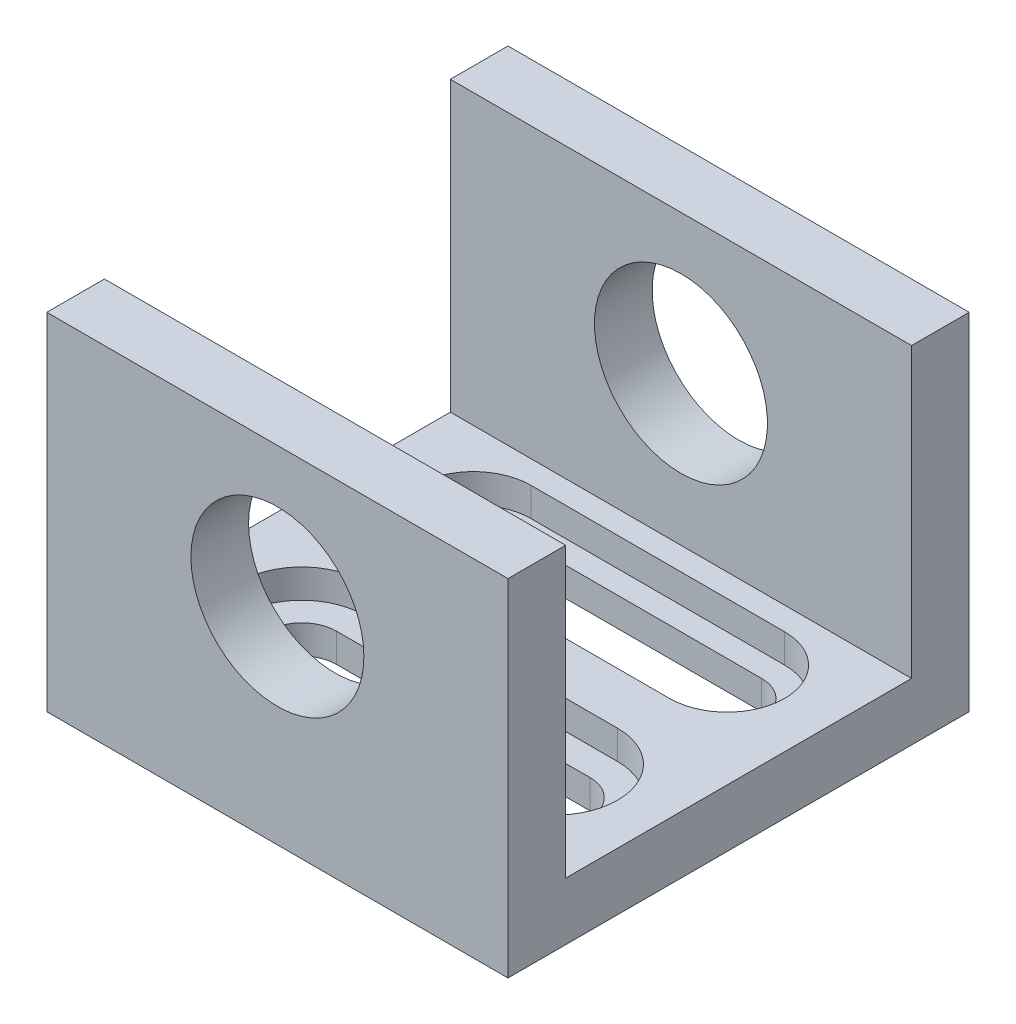
ISO-10303-21;
HEADER;
FILE_DESCRIPTION(('STEP AP214'),'2;1');
FILE_NAME('part.step','',(''),(''),'','','');
FILE_SCHEMA(('AUTOMOTIVE_DESIGN { 1 0 10303 214 1 1 1 1 }'));
ENDSEC;
DATA;
#1=APPLICATION_CONTEXT('core data for automotive mechanical design processes');
#2=APPLICATION_PROTOCOL_DEFINITION('international standard','automotive_design',2000,#1);
#3=PRODUCT_CONTEXT('',#1,'mechanical');
#4=PRODUCT('Part','Part','',(#3));
#5=PRODUCT_RELATED_PRODUCT_CATEGORY('part','',(#4));
#6=PRODUCT_DEFINITION_FORMATION('','',#4);
#7=PRODUCT_DEFINITION_CONTEXT('part definition',#1,'design');
#8=PRODUCT_DEFINITION('design','',#6,#7);
#9=PRODUCT_DEFINITION_SHAPE('','',#8);
#10=(LENGTH_UNIT() NAMED_UNIT(*) SI_UNIT(.MILLI.,.METRE.));
#11=(NAMED_UNIT(*) PLANE_ANGLE_UNIT() SI_UNIT($,.RADIAN.));
#12=(NAMED_UNIT(*) SI_UNIT($,.STERADIAN.) SOLID_ANGLE_UNIT());
#13=UNCERTAINTY_MEASURE_WITH_UNIT(LENGTH_MEASURE(1.E-05),#10,'distance_accuracy_value','');
#14=(GEOMETRIC_REPRESENTATION_CONTEXT(3) GLOBAL_UNCERTAINTY_ASSIGNED_CONTEXT((#13)) GLOBAL_UNIT_ASSIGNED_CONTEXT((#10,
#11,#12)) REPRESENTATION_CONTEXT('',''));
#15=CARTESIAN_POINT('',(0.,0.,0.));
#16=DIRECTION('',(0.,0.,1.));
#17=DIRECTION('',(1.,0.,0.));
#18=AXIS2_PLACEMENT_3D('',#15,#16,#17);
#19=CARTESIAN_POINT('',(-9.74589757868136,0.,0.));
#20=DIRECTION('',(0.,1.,0.));
#21=DIRECTION('',(-1.,0.,0.));
#22=AXIS2_PLACEMENT_3D('',#19,#20,#21);
#23=PLANE('',#22);
#24=DIRECTION('',(0.,0.,-1.));
#25=VECTOR('',#24,1.);
#26=CARTESIAN_POINT('',(-35.1458975786814,0.,0.));
#27=LINE('',#26,#25);
#28=CARTESIAN_POINT('',(-35.1458975786814,0.,22.225));
#29=VERTEX_POINT('',#28);
#30=CARTESIAN_POINT('',(-35.1458975786814,0.,-3.175));
#31=VERTEX_POINT('',#30);
#32=EDGE_CURVE('E316',#29,#31,#27,.T.);
#33=ORIENTED_EDGE('',*,*,#32,.T.);
#34=DIRECTION('',(-1.,0.,0.));
#35=VECTOR('',#34,1.);
#36=CARTESIAN_POINT('',(-9.74589757868136,0.,-3.175));
#37=LINE('',#36,#35);
#38=CARTESIAN_POINT('',(-9.74589757868136,0.,-3.175));
#39=VERTEX_POINT('',#38);
#40=EDGE_CURVE('E367',#39,#31,#37,.T.);
#41=ORIENTED_EDGE('',*,*,#40,.F.);
#42=DIRECTION('',(0.,0.,-1.));
#43=VECTOR('',#42,1.);
#44=CARTESIAN_POINT('',(-9.74589757868136,0.,-3.175));
#45=LINE('',#44,#43);
#46=CARTESIAN_POINT('',(-9.74589757868136,0.,22.225));
#47=VERTEX_POINT('',#46);
#48=EDGE_CURVE('E312',#47,#39,#45,.T.);
#49=ORIENTED_EDGE('',*,*,#48,.F.);
#50=DIRECTION('',(-1.,0.,0.));
#51=VECTOR('',#50,1.);
#52=CARTESIAN_POINT('',(-9.74589757868136,0.,22.225));
#53=LINE('',#52,#51);
#54=EDGE_CURVE('E331',#47,#29,#53,.T.);
#55=ORIENTED_EDGE('',*,*,#54,.T.);
#56=EDGE_LOOP('',(#33,#41,#49,#55));
#57=FACE_BOUND('',#56,.T.);
#58=DIRECTION('',(1.,0.,0.));
#59=VECTOR('',#58,1.);
#60=CARTESIAN_POINT('',(-9.74589757868136,0.,2.54));
#61=LINE('',#60,#59);
#62=CARTESIAN_POINT('',(-29.4308975786814,0.,2.54));
#63=VERTEX_POINT('',#62);
#64=CARTESIAN_POINT('',(-15.4608975786814,0.,2.54));
#65=VERTEX_POINT('',#64);
#66=EDGE_CURVE('E378',#63,#65,#61,.T.);
#67=ORIENTED_EDGE('',*,*,#66,.F.);
#68=CARTESIAN_POINT('',(-29.4308975786814,0.,4.445));
#69=DIRECTION('',(0.,1.,0.));
#70=DIRECTION('',(-1.,0.,0.));
#71=AXIS2_PLACEMENT_3D('',#68,#69,#70);
#72=CIRCLE('',#71,1.905);
#73=CARTESIAN_POINT('',(-29.4308975786814,0.,6.35));
#74=VERTEX_POINT('',#73);
#75=EDGE_CURVE('E380',#63,#74,#72,.T.);
#76=ORIENTED_EDGE('',*,*,#75,.T.);
#77=DIRECTION('',(1.,0.,0.));
#78=VECTOR('',#77,1.);
#79=CARTESIAN_POINT('',(-9.74589757868136,0.,6.35));
#80=LINE('',#79,#78);
#81=CARTESIAN_POINT('',(-15.4608975786814,0.,6.35));
#82=VERTEX_POINT('',#81);
#83=EDGE_CURVE('E370',#74,#82,#80,.T.);
#84=ORIENTED_EDGE('',*,*,#83,.T.);
#85=CARTESIAN_POINT('',(-15.4608975786814,0.,4.445));
#86=DIRECTION('',(0.,1.,0.));
#87=DIRECTION('',(-1.,0.,0.));
#88=AXIS2_PLACEMENT_3D('',#85,#86,#87);
#89=CIRCLE('',#88,1.905);
#90=EDGE_CURVE('E375',#65,#82,#89,.F.);
#91=ORIENTED_EDGE('',*,*,#90,.F.);
#92=EDGE_LOOP('',(#67,#76,#84,#91));
#93=FACE_BOUND('',#92,.T.);
#94=DIRECTION('',(1.,0.,0.));
#95=VECTOR('',#94,1.);
#96=CARTESIAN_POINT('',(0.,0.,11.9938408030583));
#97=LINE('',#96,#95);
#98=CARTESIAN_POINT('',(-29.4308975786814,0.,11.9938408030583));
#99=VERTEX_POINT('',#98);
#100=CARTESIAN_POINT('',(-15.4608975786814,0.,11.9938408030583));
#101=VERTEX_POINT('',#100);
#102=EDGE_CURVE('E197',#99,#101,#97,.T.);
#103=ORIENTED_EDGE('',*,*,#102,.F.);
#104=CARTESIAN_POINT('',(-29.4308975786814,0.,13.8988408030583));
#105=DIRECTION('',(0.,1.,0.));
#106=DIRECTION('',(-1.,0.,0.));
#107=AXIS2_PLACEMENT_3D('',#104,#105,#106);
#108=CIRCLE('',#107,1.905);
#109=CARTESIAN_POINT('',(-29.4308975786814,0.,15.8038408030583));
#110=VERTEX_POINT('',#109);
#111=EDGE_CURVE('E204',#99,#110,#108,.T.);
#112=ORIENTED_EDGE('',*,*,#111,.T.);
#113=DIRECTION('',(1.,0.,0.));
#114=VECTOR('',#113,1.);
#115=CARTESIAN_POINT('',(0.,0.,15.8038408030583));
#116=LINE('',#115,#114);
#117=CARTESIAN_POINT('',(-15.4608975786814,0.,15.8038408030583));
#118=VERTEX_POINT('',#117);
#119=EDGE_CURVE('E49',#110,#118,#116,.T.);
#120=ORIENTED_EDGE('',*,*,#119,.T.);
#121=CARTESIAN_POINT('',(-15.4608975786814,0.,13.8988408030583));
#122=DIRECTION('',(0.,1.,0.));
#123=DIRECTION('',(-1.,0.,0.));
#124=AXIS2_PLACEMENT_3D('',#121,#122,#123);
#125=CIRCLE('',#124,1.905);
#126=EDGE_CURVE('E201',#118,#101,#125,.T.);
#127=ORIENTED_EDGE('',*,*,#126,.T.);
#128=EDGE_LOOP('',(#103,#112,#120,#127));
#129=FACE_BOUND('',#128,.T.);
#130=ADVANCED_FACE('F34',(#57,#93,#129),#23,.F.);
#131=CARTESIAN_POINT('',(0.,1.5875,0.));
#132=DIRECTION('',(0.,1.,0.));
#133=DIRECTION('',(-1.,0.,0.));
#134=AXIS2_PLACEMENT_3D('',#131,#132,#133);
#135=PLANE('',#134);
#136=DIRECTION('',(-1.,0.,0.));
#137=VECTOR('',#136,1.);
#138=CARTESIAN_POINT('',(0.,1.5875,17.3278408030583));
#139=LINE('',#138,#137);
#140=CARTESIAN_POINT('',(-15.4608975786814,1.5875,17.3278408030583));
#141=VERTEX_POINT('',#140);
#142=CARTESIAN_POINT('',(-29.4308975786814,1.58750000000001,17.3278408030583));
#143=VERTEX_POINT('',#142);
#144=EDGE_CURVE('E221',#141,#143,#139,.T.);
#145=ORIENTED_EDGE('',*,*,#144,.F.);
#146=CARTESIAN_POINT('',(-15.4608975786814,1.58750000000001,13.8988408030583));
#147=DIRECTION('',(0.,1.,0.));
#148=DIRECTION('',(-1.,0.,0.));
#149=AXIS2_PLACEMENT_3D('',#146,#147,#148);
#150=CIRCLE('',#149,3.429);
#151=CARTESIAN_POINT('',(-15.4608975786814,1.58750000000001,10.4698408030583));
#152=VERTEX_POINT('',#151);
#153=EDGE_CURVE('E223',#141,#152,#150,.T.);
#154=ORIENTED_EDGE('',*,*,#153,.T.);
#155=DIRECTION('',(1.,0.,0.));
#156=VECTOR('',#155,1.);
#157=CARTESIAN_POINT('',(0.,1.5875,10.4698408030583));
#158=LINE('',#157,#156);
#159=CARTESIAN_POINT('',(-29.4308975786814,1.58750000000001,10.4698408030583));
#160=VERTEX_POINT('',#159);
#161=EDGE_CURVE('E227',#160,#152,#158,.T.);
#162=ORIENTED_EDGE('',*,*,#161,.F.);
#163=CARTESIAN_POINT('',(-29.4308975786814,1.58750000000001,13.8988408030583));
#164=DIRECTION('',(0.,1.,0.));
#165=DIRECTION('',(-1.,0.,0.));
#166=AXIS2_PLACEMENT_3D('',#163,#164,#165);
#167=CIRCLE('',#166,3.429);
#168=EDGE_CURVE('E229',#160,#143,#167,.T.);
#169=ORIENTED_EDGE('',*,*,#168,.T.);
#170=EDGE_LOOP('',(#145,#154,#162,#169));
#171=FACE_BOUND('',#170,.T.);
#172=CARTESIAN_POINT('',(-29.4308975786814,1.58750000000001,13.8988408030583));
#173=DIRECTION('',(0.,1.,0.));
#174=DIRECTION('',(-1.,0.,0.));
#175=AXIS2_PLACEMENT_3D('',#172,#173,#174);
#176=CIRCLE('',#175,1.905);
#177=CARTESIAN_POINT('',(-29.4308975786814,1.58750000000001,11.9938408030583));
#178=VERTEX_POINT('',#177);
#179=CARTESIAN_POINT('',(-29.4308975786814,1.58750000000001,15.8038408030583));
#180=VERTEX_POINT('',#179);
#181=EDGE_CURVE('E385',#178,#180,#176,.T.);
#182=ORIENTED_EDGE('',*,*,#181,.F.);
#183=DIRECTION('',(1.,0.,0.));
#184=VECTOR('',#183,1.);
#185=CARTESIAN_POINT('',(0.,1.5875,11.9938408030583));
#186=LINE('',#185,#184);
#187=CARTESIAN_POINT('',(-15.4608975786814,1.58750000000001,11.9938408030583));
#188=VERTEX_POINT('',#187);
#189=EDGE_CURVE('E11',#178,#188,#186,.T.);
#190=ORIENTED_EDGE('',*,*,#189,.T.);
#191=CARTESIAN_POINT('',(-15.4608975786814,1.58750000000001,13.8988408030583));
#192=DIRECTION('',(0.,1.,0.));
#193=DIRECTION('',(-1.,0.,0.));
#194=AXIS2_PLACEMENT_3D('',#191,#192,#193);
#195=CIRCLE('',#194,1.905);
#196=CARTESIAN_POINT('',(-15.4608975786814,1.58750000000001,15.8038408030583));
#197=VERTEX_POINT('',#196);
#198=EDGE_CURVE('E42',#197,#188,#195,.T.);
#199=ORIENTED_EDGE('',*,*,#198,.F.);
#200=DIRECTION('',(1.,0.,0.));
#201=VECTOR('',#200,1.);
#202=CARTESIAN_POINT('',(0.,1.5875,15.8038408030583));
#203=LINE('',#202,#201);
#204=EDGE_CURVE('E387',#180,#197,#203,.T.);
#205=ORIENTED_EDGE('',*,*,#204,.F.);
#206=EDGE_LOOP('',(#182,#190,#199,#205));
#207=FACE_BOUND('',#206,.T.);
#208=ADVANCED_FACE('F393',(#171,#207),#135,.T.);
#209=CARTESIAN_POINT('',(-9.74589757868136,3.175,0.));
#210=DIRECTION('',(0.,-1.,0.));
#211=DIRECTION('',(1.,0.,0.));
#212=AXIS2_PLACEMENT_3D('',#209,#210,#211);
#213=PLANE('',#212);
#214=DIRECTION('',(0.,0.,1.));
#215=VECTOR('',#214,1.);
#216=CARTESIAN_POINT('',(-35.1458975786814,3.17500000000001,0.));
#217=LINE('',#216,#215);
#218=CARTESIAN_POINT('',(-35.1458975786814,3.17500000000001,0.));
#219=VERTEX_POINT('',#218);
#220=CARTESIAN_POINT('',(-35.1458975786814,3.17500000000001,19.05));
#221=VERTEX_POINT('',#220);
#222=EDGE_CURVE('E337',#219,#221,#217,.T.);
#223=ORIENTED_EDGE('',*,*,#222,.T.);
#224=DIRECTION('',(-1.,0.,0.));
#225=VECTOR('',#224,1.);
#226=CARTESIAN_POINT('',(-9.74589757868136,3.175,19.05));
#227=LINE('',#226,#225);
#228=CARTESIAN_POINT('',(-9.74589757868136,3.175,19.05));
#229=VERTEX_POINT('',#228);
#230=EDGE_CURVE('E355',#229,#221,#227,.T.);
#231=ORIENTED_EDGE('',*,*,#230,.F.);
#232=DIRECTION('',(0.,0.,1.));
#233=VECTOR('',#232,1.);
#234=CARTESIAN_POINT('',(-9.74589757868136,3.175,0.));
#235=LINE('',#234,#233);
#236=CARTESIAN_POINT('',(-9.74589757868136,3.175,0.));
#237=VERTEX_POINT('',#236);
#238=EDGE_CURVE('E322',#237,#229,#235,.T.);
#239=ORIENTED_EDGE('',*,*,#238,.F.);
#240=DIRECTION('',(-1.,0.,0.));
#241=VECTOR('',#240,1.);
#242=CARTESIAN_POINT('',(-9.74589757868136,3.175,0.));
#243=LINE('',#242,#241);
#244=EDGE_CURVE('E358',#237,#219,#243,.T.);
#245=ORIENTED_EDGE('',*,*,#244,.T.);
#246=EDGE_LOOP('',(#223,#231,#239,#245));
#247=FACE_BOUND('',#246,.T.);
#248=DIRECTION('',(1.,0.,0.));
#249=VECTOR('',#248,1.);
#250=CARTESIAN_POINT('',(-29.4308975786814,3.17500000000001,7.62));
#251=LINE('',#250,#249);
#252=CARTESIAN_POINT('',(-29.4308975786814,3.17500000000001,7.62));
#253=VERTEX_POINT('',#252);
#254=CARTESIAN_POINT('',(-15.4608975786814,3.17500000000001,7.62));
#255=VERTEX_POINT('',#254);
#256=EDGE_CURVE('E265',#253,#255,#251,.T.);
#257=ORIENTED_EDGE('',*,*,#256,.F.);
#258=CARTESIAN_POINT('',(-29.4308975786814,3.17500000000001,4.445));
#259=DIRECTION('',(0.,1.,0.));
#260=DIRECTION('',(-1.,0.,0.));
#261=AXIS2_PLACEMENT_3D('',#258,#259,#260);
#262=CIRCLE('',#261,3.175);
#263=CARTESIAN_POINT('',(-29.4308975786814,3.17500000000001,1.27));
#264=VERTEX_POINT('',#263);
#265=EDGE_CURVE('E245',#264,#253,#262,.T.);
#266=ORIENTED_EDGE('',*,*,#265,.F.);
#267=DIRECTION('',(1.,0.,0.));
#268=VECTOR('',#267,1.);
#269=CARTESIAN_POINT('',(-29.4308975786814,3.17500000000001,1.27));
#270=LINE('',#269,#268);
#271=CARTESIAN_POINT('',(-15.4608975786814,3.17500000000001,1.27));
#272=VERTEX_POINT('',#271);
#273=EDGE_CURVE('E256',#264,#272,#270,.T.);
#274=ORIENTED_EDGE('',*,*,#273,.T.);
#275=CARTESIAN_POINT('',(-15.4608975786814,3.17500000000001,4.445));
#276=DIRECTION('',(0.,-1.,0.));
#277=DIRECTION('',(1.,0.,0.));
#278=AXIS2_PLACEMENT_3D('',#275,#276,#277);
#279=CIRCLE('',#278,3.175);
#280=EDGE_CURVE('E268',#272,#255,#279,.T.);
#281=ORIENTED_EDGE('',*,*,#280,.T.);
#282=EDGE_LOOP('',(#257,#266,#274,#281));
#283=FACE_BOUND('',#282,.T.);
#284=DIRECTION('',(-1.,0.,0.));
#285=VECTOR('',#284,1.);
#286=CARTESIAN_POINT('',(0.,3.175,17.3278408030583));
#287=LINE('',#286,#285);
#288=CARTESIAN_POINT('',(-15.4608975786814,3.175,17.3278408030583));
#289=VERTEX_POINT('',#288);
#290=CARTESIAN_POINT('',(-29.4308975786814,3.17500000000001,17.3278408030583));
#291=VERTEX_POINT('',#290);
#292=EDGE_CURVE('E216',#289,#291,#287,.T.);
#293=ORIENTED_EDGE('',*,*,#292,.T.);
#294=CARTESIAN_POINT('',(-29.4308975786814,3.17500000000001,13.8988408030583));
#295=DIRECTION('',(0.,1.,0.));
#296=DIRECTION('',(-1.,0.,0.));
#297=AXIS2_PLACEMENT_3D('',#294,#295,#296);
#298=CIRCLE('',#297,3.429);
#299=CARTESIAN_POINT('',(-29.4308975786814,3.17500000000001,10.4698408030583));
#300=VERTEX_POINT('',#299);
#301=EDGE_CURVE('E224',#300,#291,#298,.T.);
#302=ORIENTED_EDGE('',*,*,#301,.F.);
#303=DIRECTION('',(1.,0.,0.));
#304=VECTOR('',#303,1.);
#305=CARTESIAN_POINT('',(0.,3.175,10.4698408030583));
#306=LINE('',#305,#304);
#307=CARTESIAN_POINT('',(-15.4608975786814,3.17500000000001,10.4698408030583));
#308=VERTEX_POINT('',#307);
#309=EDGE_CURVE('E238',#300,#308,#306,.T.);
#310=ORIENTED_EDGE('',*,*,#309,.T.);
#311=CARTESIAN_POINT('',(-15.4608975786814,3.17500000000001,13.8988408030583));
#312=DIRECTION('',(0.,1.,0.));
#313=DIRECTION('',(-1.,0.,0.));
#314=AXIS2_PLACEMENT_3D('',#311,#312,#313);
#315=CIRCLE('',#314,3.429);
#316=EDGE_CURVE('E235',#289,#308,#315,.T.);
#317=ORIENTED_EDGE('',*,*,#316,.F.);
#318=EDGE_LOOP('',(#293,#302,#310,#317));
#319=FACE_BOUND('',#318,.T.);
#320=ADVANCED_FACE('F409',(#247,#283,#319),#213,.F.);
#321=CARTESIAN_POINT('',(-29.4308975786814,-62.865,4.44499999999999));
#322=DIRECTION('',(0.,1.,0.));
#323=DIRECTION('',(-1.,0.,0.));
#324=AXIS2_PLACEMENT_3D('',#321,#322,#323);
#325=CYLINDRICAL_SURFACE('',#324,1.905);
#326=CARTESIAN_POINT('',(-29.4308975786814,1.58750000000001,4.445));
#327=DIRECTION('',(0.,1.,0.));
#328=DIRECTION('',(-1.,0.,0.));
#329=AXIS2_PLACEMENT_3D('',#326,#327,#328);
#330=CIRCLE('',#329,1.905);
#331=CARTESIAN_POINT('',(-29.4308975786814,1.58750000000001,6.35));
#332=VERTEX_POINT('',#331);
#333=CARTESIAN_POINT('',(-29.4308975786814,1.58750000000001,2.54));
#334=VERTEX_POINT('',#333);
#335=EDGE_CURVE('E287',#332,#334,#330,.F.);
#336=ORIENTED_EDGE('',*,*,#335,.F.);
#337=DIRECTION('',(0.,1.,0.));
#338=VECTOR('',#337,1.);
#339=CARTESIAN_POINT('',(-29.4308975786814,-62.865,6.34999999999999));
#340=LINE('',#339,#338);
#341=EDGE_CURVE('E289',#74,#332,#340,.T.);
#342=ORIENTED_EDGE('',*,*,#341,.F.);
#343=ORIENTED_EDGE('',*,*,#75,.F.);
#344=DIRECTION('',(0.,1.,0.));
#345=VECTOR('',#344,1.);
#346=CARTESIAN_POINT('',(-29.4308975786814,-62.865,2.53999999999999));
#347=LINE('',#346,#345);
#348=EDGE_CURVE('E290',#63,#334,#347,.T.);
#349=ORIENTED_EDGE('',*,*,#348,.T.);
#350=EDGE_LOOP('',(#336,#342,#343,#349));
#351=FACE_BOUND('',#350,.T.);
#352=ADVANCED_FACE('F433',(#351),#325,.F.);
#353=CARTESIAN_POINT('',(-29.4308975786814,-62.865,2.53999999999999));
#354=DIRECTION('',(0.,0.,1.));
#355=DIRECTION('',(0.,-1.,0.));
#356=AXIS2_PLACEMENT_3D('',#353,#354,#355);
#357=PLANE('',#356);
#358=DIRECTION('',(0.,1.,0.));
#359=VECTOR('',#358,1.);
#360=CARTESIAN_POINT('',(-15.4608975786814,-62.865,2.53999999999999));
#361=LINE('',#360,#359);
#362=CARTESIAN_POINT('',(-15.4608975786814,1.58750000000001,2.54));
#363=VERTEX_POINT('',#362);
#364=EDGE_CURVE('E294',#65,#363,#361,.T.);
#365=ORIENTED_EDGE('',*,*,#364,.T.);
#366=DIRECTION('',(-1.,0.,0.));
#367=VECTOR('',#366,1.);
#368=CARTESIAN_POINT('',(-29.4308975786814,1.58750000000001,2.54));
#369=LINE('',#368,#367);
#370=EDGE_CURVE('E284',#363,#334,#369,.T.);
#371=ORIENTED_EDGE('',*,*,#370,.T.);
#372=ORIENTED_EDGE('',*,*,#348,.F.);
#373=ORIENTED_EDGE('',*,*,#66,.T.);
#374=EDGE_LOOP('',(#365,#371,#372,#373));
#375=FACE_BOUND('',#374,.T.);
#376=ADVANCED_FACE('F486',(#375),#357,.T.);
#377=CARTESIAN_POINT('',(-15.4608975786814,-62.865,4.44499999999999));
#378=DIRECTION('',(0.,1.,0.));
#379=DIRECTION('',(-1.,0.,0.));
#380=AXIS2_PLACEMENT_3D('',#377,#378,#379);
#381=CYLINDRICAL_SURFACE('',#380,1.905);
#382=DIRECTION('',(0.,1.,0.));
#383=VECTOR('',#382,1.);
#384=CARTESIAN_POINT('',(-15.4608975786814,-62.865,6.34999999999999));
#385=LINE('',#384,#383);
#386=CARTESIAN_POINT('',(-15.4608975786814,1.58750000000001,6.35));
#387=VERTEX_POINT('',#386);
#388=EDGE_CURVE('E297',#82,#387,#385,.T.);
#389=ORIENTED_EDGE('',*,*,#388,.T.);
#390=CARTESIAN_POINT('',(-15.4608975786814,1.58750000000001,4.445));
#391=DIRECTION('',(0.,1.,0.));
#392=DIRECTION('',(-1.,0.,0.));
#393=AXIS2_PLACEMENT_3D('',#390,#391,#392);
#394=CIRCLE('',#393,1.905);
#395=EDGE_CURVE('E275',#387,#363,#394,.T.);
#396=ORIENTED_EDGE('',*,*,#395,.T.);
#397=ORIENTED_EDGE('',*,*,#364,.F.);
#398=ORIENTED_EDGE('',*,*,#90,.T.);
#399=EDGE_LOOP('',(#389,#396,#397,#398));
#400=FACE_BOUND('',#399,.T.);
#401=ADVANCED_FACE('F490',(#400),#381,.F.);
#402=CARTESIAN_POINT('',(-29.4308975786814,-62.865,6.34999999999999));
#403=DIRECTION('',(0.,0.,1.));
#404=DIRECTION('',(0.,-1.,0.));
#405=AXIS2_PLACEMENT_3D('',#402,#403,#404);
#406=PLANE('',#405);
#407=DIRECTION('',(-1.,0.,0.));
#408=VECTOR('',#407,1.);
#409=CARTESIAN_POINT('',(-29.4308975786814,1.58750000000001,6.35));
#410=LINE('',#409,#408);
#411=EDGE_CURVE('E383',#387,#332,#410,.T.);
#412=ORIENTED_EDGE('',*,*,#411,.F.);
#413=ORIENTED_EDGE('',*,*,#388,.F.);
#414=ORIENTED_EDGE('',*,*,#83,.F.);
#415=ORIENTED_EDGE('',*,*,#341,.T.);
#416=EDGE_LOOP('',(#412,#413,#414,#415));
#417=FACE_BOUND('',#416,.T.);
#418=ADVANCED_FACE('F443',(#417),#406,.F.);
#419=CARTESIAN_POINT('',(-9.74589757868135,19.05,-3.175));
#420=DIRECTION('',(0.,0.,1.));
#421=DIRECTION('',(0.,-1.,0.));
#422=AXIS2_PLACEMENT_3D('',#419,#420,#421);
#423=PLANE('',#422);
#424=CARTESIAN_POINT('',(-22.4458975786814,11.3665,-3.175));
#425=DIRECTION('',(0.,0.,-1.));
#426=DIRECTION('',(0.,1.,0.));
#427=AXIS2_PLACEMENT_3D('',#424,#425,#426);
#428=CIRCLE('',#427,4.7625);
#429=CARTESIAN_POINT('',(-22.4458975786814,16.129,-3.175));
#430=VERTEX_POINT('',#429);
#431=EDGE_CURVE('E293',#430,#430,#428,.T.);
#432=ORIENTED_EDGE('',*,*,#431,.F.);
#433=EDGE_LOOP('',(#432));
#434=FACE_BOUND('',#433,.T.);
#435=DIRECTION('',(0.,1.,0.));
#436=VECTOR('',#435,1.);
#437=CARTESIAN_POINT('',(-35.1458975786813,19.05,-3.175));
#438=LINE('',#437,#436);
#439=CARTESIAN_POINT('',(-35.1458975786813,19.05,-3.175));
#440=VERTEX_POINT('',#439);
#441=EDGE_CURVE('E311',#31,#440,#438,.T.);
#442=ORIENTED_EDGE('',*,*,#441,.T.);
#443=DIRECTION('',(-1.,0.,0.));
#444=VECTOR('',#443,1.);
#445=CARTESIAN_POINT('',(-9.74589757868135,19.05,-3.175));
#446=LINE('',#445,#444);
#447=CARTESIAN_POINT('',(-9.74589757868135,19.05,-3.175));
#448=VERTEX_POINT('',#447);
#449=EDGE_CURVE('E364',#448,#440,#446,.T.);
#450=ORIENTED_EDGE('',*,*,#449,.F.);
#451=DIRECTION('',(0.,1.,0.));
#452=VECTOR('',#451,1.);
#453=CARTESIAN_POINT('',(-9.74589757868135,19.05,-3.175));
#454=LINE('',#453,#452);
#455=EDGE_CURVE('E315',#39,#448,#454,.T.);
#456=ORIENTED_EDGE('',*,*,#455,.F.);
#457=ORIENTED_EDGE('',*,*,#40,.T.);
#458=EDGE_LOOP('',(#442,#450,#456,#457));
#459=FACE_BOUND('',#458,.T.);
#460=ADVANCED_FACE('F36',(#434,#459),#423,.F.);
#461=CARTESIAN_POINT('',(-9.74589757868135,19.05,-3.175));
#462=DIRECTION('',(0.,-1.,0.));
#463=DIRECTION('',(1.,0.,0.));
#464=AXIS2_PLACEMENT_3D('',#461,#462,#463);
#465=PLANE('',#464);
#466=DIRECTION('',(0.,0.,1.));
#467=VECTOR('',#466,1.);
#468=CARTESIAN_POINT('',(-35.1458975786813,19.05,-3.175));
#469=LINE('',#468,#467);
#470=CARTESIAN_POINT('',(-35.1458975786813,19.05,0.));
#471=VERTEX_POINT('',#470);
#472=EDGE_CURVE('E333',#440,#471,#469,.T.);
#473=ORIENTED_EDGE('',*,*,#472,.T.);
#474=DIRECTION('',(-1.,0.,0.));
#475=VECTOR('',#474,1.);
#476=CARTESIAN_POINT('',(-9.74589757868135,19.05,0.));
#477=LINE('',#476,#475);
#478=CARTESIAN_POINT('',(-9.74589757868135,19.05,0.));
#479=VERTEX_POINT('',#478);
#480=EDGE_CURVE('E361',#479,#471,#477,.T.);
#481=ORIENTED_EDGE('',*,*,#480,.F.);
#482=DIRECTION('',(0.,0.,1.));
#483=VECTOR('',#482,1.);
#484=CARTESIAN_POINT('',(-9.74589757868135,19.05,-3.175));
#485=LINE('',#484,#483);
#486=EDGE_CURVE('E318',#448,#479,#485,.T.);
#487=ORIENTED_EDGE('',*,*,#486,.F.);
#488=ORIENTED_EDGE('',*,*,#449,.T.);
#489=EDGE_LOOP('',(#473,#481,#487,#488));
#490=FACE_BOUND('',#489,.T.);
#491=ADVANCED_FACE('F436',(#490),#465,.F.);
#492=CARTESIAN_POINT('',(-9.74589757868135,19.05,0.));
#493=DIRECTION('',(0.,0.,-1.));
#494=DIRECTION('',(0.,1.,0.));
#495=AXIS2_PLACEMENT_3D('',#492,#493,#494);
#496=PLANE('',#495);
#497=CARTESIAN_POINT('',(-22.4458975786814,11.3665,0.));
#498=DIRECTION('',(0.,0.,-1.));
#499=DIRECTION('',(0.,1.,0.));
#500=AXIS2_PLACEMENT_3D('',#497,#498,#499);
#501=CIRCLE('',#500,4.7625);
#502=CARTESIAN_POINT('',(-22.4458975786814,16.129,0.));
#503=VERTEX_POINT('',#502);
#504=EDGE_CURVE('E308',#503,#503,#501,.T.);
#505=ORIENTED_EDGE('',*,*,#504,.T.);
#506=EDGE_LOOP('',(#505));
#507=FACE_BOUND('',#506,.T.);
#508=DIRECTION('',(0.,-1.,0.));
#509=VECTOR('',#508,1.);
#510=CARTESIAN_POINT('',(-35.1458975786813,19.05,0.));
#511=LINE('',#510,#509);
#512=EDGE_CURVE('E335',#471,#219,#511,.T.);
#513=ORIENTED_EDGE('',*,*,#512,.T.);
#514=ORIENTED_EDGE('',*,*,#244,.F.);
#515=DIRECTION('',(0.,-1.,0.));
#516=VECTOR('',#515,1.);
#517=CARTESIAN_POINT('',(-9.74589757868135,19.05,0.));
#518=LINE('',#517,#516);
#519=EDGE_CURVE('E320',#479,#237,#518,.T.);
#520=ORIENTED_EDGE('',*,*,#519,.F.);
#521=ORIENTED_EDGE('',*,*,#480,.T.);
#522=EDGE_LOOP('',(#513,#514,#520,#521));
#523=FACE_BOUND('',#522,.T.);
#524=ADVANCED_FACE('F429',(#507,#523),#496,.F.);
#525=CARTESIAN_POINT('',(-9.74589757868136,3.175,19.05));
#526=DIRECTION('',(0.,0.,1.));
#527=DIRECTION('',(1.,0.,0.));
#528=AXIS2_PLACEMENT_3D('',#525,#526,#527);
#529=PLANE('',#528);
#530=CARTESIAN_POINT('',(-22.4458975786814,11.3665,19.05));
#531=DIRECTION('',(0.,0.,1.));
#532=DIRECTION('',(1.,0.,0.));
#533=AXIS2_PLACEMENT_3D('',#530,#531,#532);
#534=CIRCLE('',#533,4.7625);
#535=CARTESIAN_POINT('',(-17.6833975786814,11.3665,19.05));
#536=VERTEX_POINT('',#535);
#537=EDGE_CURVE('E305',#536,#536,#534,.T.);
#538=ORIENTED_EDGE('',*,*,#537,.T.);
#539=EDGE_LOOP('',(#538));
#540=FACE_BOUND('',#539,.T.);
#541=DIRECTION('',(0.,1.,0.));
#542=VECTOR('',#541,1.);
#543=CARTESIAN_POINT('',(-35.1458975786814,3.17500000000001,19.05));
#544=LINE('',#543,#542);
#545=CARTESIAN_POINT('',(-35.1458975786813,19.05,19.05));
#546=VERTEX_POINT('',#545);
#547=EDGE_CURVE('E339',#221,#546,#544,.T.);
#548=ORIENTED_EDGE('',*,*,#547,.T.);
#549=DIRECTION('',(-1.,0.,0.));
#550=VECTOR('',#549,1.);
#551=CARTESIAN_POINT('',(-9.74589757868135,19.05,19.05));
#552=LINE('',#551,#550);
#553=CARTESIAN_POINT('',(-9.74589757868135,19.05,19.05));
#554=VERTEX_POINT('',#553);
#555=EDGE_CURVE('E352',#554,#546,#552,.T.);
#556=ORIENTED_EDGE('',*,*,#555,.F.);
#557=DIRECTION('',(0.,1.,0.));
#558=VECTOR('',#557,1.);
#559=CARTESIAN_POINT('',(-9.74589757868136,3.175,19.05));
#560=LINE('',#559,#558);
#561=EDGE_CURVE('E324',#229,#554,#560,.T.);
#562=ORIENTED_EDGE('',*,*,#561,.F.);
#563=ORIENTED_EDGE('',*,*,#230,.T.);
#564=EDGE_LOOP('',(#548,#556,#562,#563));
#565=FACE_BOUND('',#564,.T.);
#566=ADVANCED_FACE('F425',(#540,#565),#529,.F.);
#567=CARTESIAN_POINT('',(-9.74589757868135,19.05,19.05));
#568=DIRECTION('',(0.,-1.,0.));
#569=DIRECTION('',(1.,0.,0.));
#570=AXIS2_PLACEMENT_3D('',#567,#568,#569);
#571=PLANE('',#570);
#572=DIRECTION('',(0.,0.,1.));
#573=VECTOR('',#572,1.);
#574=CARTESIAN_POINT('',(-35.1458975786813,19.05,19.05));
#575=LINE('',#574,#573);
#576=CARTESIAN_POINT('',(-35.1458975786813,19.05,22.225));
#577=VERTEX_POINT('',#576);
#578=EDGE_CURVE('E341',#546,#577,#575,.T.);
#579=ORIENTED_EDGE('',*,*,#578,.T.);
#580=DIRECTION('',(-1.,0.,0.));
#581=VECTOR('',#580,1.);
#582=CARTESIAN_POINT('',(-9.74589757868135,19.05,22.225));
#583=LINE('',#582,#581);
#584=CARTESIAN_POINT('',(-9.74589757868135,19.05,22.225));
#585=VERTEX_POINT('',#584);
#586=EDGE_CURVE('E349',#585,#577,#583,.T.);
#587=ORIENTED_EDGE('',*,*,#586,.F.);
#588=DIRECTION('',(0.,0.,1.));
#589=VECTOR('',#588,1.);
#590=CARTESIAN_POINT('',(-9.74589757868135,19.05,19.05));
#591=LINE('',#590,#589);
#592=EDGE_CURVE('E326',#554,#585,#591,.T.);
#593=ORIENTED_EDGE('',*,*,#592,.F.);
#594=ORIENTED_EDGE('',*,*,#555,.T.);
#595=EDGE_LOOP('',(#579,#587,#593,#594));
#596=FACE_BOUND('',#595,.T.);
#597=ADVANCED_FACE('F421',(#596),#571,.F.);
#598=CARTESIAN_POINT('',(-9.74589757868136,0.,22.225));
#599=DIRECTION('',(0.,0.,-1.));
#600=DIRECTION('',(-1.,0.,0.));
#601=AXIS2_PLACEMENT_3D('',#598,#599,#600);
#602=PLANE('',#601);
#603=CARTESIAN_POINT('',(-22.4458975786814,11.3665,22.225));
#604=DIRECTION('',(0.,0.,-1.));
#605=DIRECTION('',(-1.,0.,0.));
#606=AXIS2_PLACEMENT_3D('',#603,#604,#605);
#607=CIRCLE('',#606,4.7625);
#608=CARTESIAN_POINT('',(-27.2083975786814,11.3665,22.225));
#609=VERTEX_POINT('',#608);
#610=EDGE_CURVE('E304',#609,#609,#607,.T.);
#611=ORIENTED_EDGE('',*,*,#610,.T.);
#612=EDGE_LOOP('',(#611));
#613=FACE_BOUND('',#612,.T.);
#614=DIRECTION('',(0.,-1.,0.));
#615=VECTOR('',#614,1.);
#616=CARTESIAN_POINT('',(-35.1458975786814,0.,22.225));
#617=LINE('',#616,#615);
#618=EDGE_CURVE('E343',#577,#29,#617,.T.);
#619=ORIENTED_EDGE('',*,*,#618,.T.);
#620=ORIENTED_EDGE('',*,*,#54,.F.);
#621=DIRECTION('',(0.,-1.,0.));
#622=VECTOR('',#621,1.);
#623=CARTESIAN_POINT('',(-9.74589757868136,0.,22.225));
#624=LINE('',#623,#622);
#625=EDGE_CURVE('E328',#585,#47,#624,.T.);
#626=ORIENTED_EDGE('',*,*,#625,.F.);
#627=ORIENTED_EDGE('',*,*,#586,.T.);
#628=EDGE_LOOP('',(#619,#620,#626,#627));
#629=FACE_BOUND('',#628,.T.);
#630=ADVANCED_FACE('F417',(#613,#629),#602,.F.);
#631=CARTESIAN_POINT('',(-9.74589757868136,0.,0.));
#632=DIRECTION('',(-1.,0.,0.));
#633=DIRECTION('',(0.,-1.,0.));
#634=AXIS2_PLACEMENT_3D('',#631,#632,#633);
#635=PLANE('',#634);
#636=ORIENTED_EDGE('',*,*,#48,.T.);
#637=ORIENTED_EDGE('',*,*,#455,.T.);
#638=ORIENTED_EDGE('',*,*,#486,.T.);
#639=ORIENTED_EDGE('',*,*,#519,.T.);
#640=ORIENTED_EDGE('',*,*,#238,.T.);
#641=ORIENTED_EDGE('',*,*,#561,.T.);
#642=ORIENTED_EDGE('',*,*,#592,.T.);
#643=ORIENTED_EDGE('',*,*,#625,.T.);
#644=EDGE_LOOP('',(#636,#637,#638,#639,#640,#641,#642,#643));
#645=FACE_BOUND('',#644,.T.);
#646=ADVANCED_FACE('F420',(#645),#635,.F.);
#647=CARTESIAN_POINT('',(-35.1458975786814,0.,0.));
#648=DIRECTION('',(-1.,0.,0.));
#649=DIRECTION('',(0.,-1.,0.));
#650=AXIS2_PLACEMENT_3D('',#647,#648,#649);
#651=PLANE('',#650);
#652=ORIENTED_EDGE('',*,*,#441,.F.);
#653=ORIENTED_EDGE('',*,*,#32,.F.);
#654=ORIENTED_EDGE('',*,*,#618,.F.);
#655=ORIENTED_EDGE('',*,*,#578,.F.);
#656=ORIENTED_EDGE('',*,*,#547,.F.);
#657=ORIENTED_EDGE('',*,*,#222,.F.);
#658=ORIENTED_EDGE('',*,*,#512,.F.);
#659=ORIENTED_EDGE('',*,*,#472,.F.);
#660=EDGE_LOOP('',(#652,#653,#654,#655,#656,#657,#658,#659));
#661=FACE_BOUND('',#660,.T.);
#662=ADVANCED_FACE('F415',(#661),#651,.T.);
#663=CARTESIAN_POINT('',(-22.4458975786814,11.3665,33.401));
#664=DIRECTION('',(0.,0.,-1.));
#665=DIRECTION('',(0.,1.,0.));
#666=AXIS2_PLACEMENT_3D('',#663,#664,#665);
#667=CYLINDRICAL_SURFACE('',#666,4.7625);
#668=ORIENTED_EDGE('',*,*,#610,.F.);
#669=EDGE_LOOP('',(#668));
#670=FACE_BOUND('',#669,.T.);
#671=ORIENTED_EDGE('',*,*,#537,.F.);
#672=EDGE_LOOP('',(#671));
#673=FACE_BOUND('',#672,.T.);
#674=ADVANCED_FACE('F477',(#670,#673),#667,.F.);
#675=ORIENTED_EDGE('',*,*,#431,.T.);
#676=EDGE_LOOP('',(#675));
#677=FACE_BOUND('',#676,.T.);
#678=ORIENTED_EDGE('',*,*,#504,.F.);
#679=EDGE_LOOP('',(#678));
#680=FACE_BOUND('',#679,.T.);
#681=ADVANCED_FACE('F479',(#677,#680),#667,.F.);
#682=CARTESIAN_POINT('',(-29.4308975786814,1.58750000000001,4.445));
#683=DIRECTION('',(0.,1.,0.));
#684=DIRECTION('',(-1.,0.,0.));
#685=AXIS2_PLACEMENT_3D('',#682,#683,#684);
#686=PLANE('',#685);
#687=CARTESIAN_POINT('',(-29.4308975786814,1.58750000000001,4.445));
#688=DIRECTION('',(0.,1.,0.));
#689=DIRECTION('',(-1.,0.,0.));
#690=AXIS2_PLACEMENT_3D('',#687,#688,#689);
#691=CIRCLE('',#690,3.175);
#692=CARTESIAN_POINT('',(-29.4308975786814,1.58750000000001,1.27));
#693=VERTEX_POINT('',#692);
#694=CARTESIAN_POINT('',(-29.4308975786814,1.58750000000001,7.62));
#695=VERTEX_POINT('',#694);
#696=EDGE_CURVE('E252',#693,#695,#691,.T.);
#697=ORIENTED_EDGE('',*,*,#696,.T.);
#698=DIRECTION('',(1.,0.,0.));
#699=VECTOR('',#698,1.);
#700=CARTESIAN_POINT('',(-29.4308975786814,1.58750000000001,7.62));
#701=LINE('',#700,#699);
#702=CARTESIAN_POINT('',(-15.4608975786814,1.58750000000001,7.62));
#703=VERTEX_POINT('',#702);
#704=EDGE_CURVE('E255',#695,#703,#701,.T.);
#705=ORIENTED_EDGE('',*,*,#704,.T.);
#706=CARTESIAN_POINT('',(-15.4608975786814,1.58750000000001,4.445));
#707=DIRECTION('',(0.,-1.,0.));
#708=DIRECTION('',(1.,0.,0.));
#709=AXIS2_PLACEMENT_3D('',#706,#707,#708);
#710=CIRCLE('',#709,3.175);
#711=CARTESIAN_POINT('',(-15.4608975786814,1.58750000000001,1.27));
#712=VERTEX_POINT('',#711);
#713=EDGE_CURVE('E259',#712,#703,#710,.T.);
#714=ORIENTED_EDGE('',*,*,#713,.F.);
#715=DIRECTION('',(1.,0.,0.));
#716=VECTOR('',#715,1.);
#717=CARTESIAN_POINT('',(-29.4308975786814,1.58750000000001,1.27));
#718=LINE('',#717,#716);
#719=EDGE_CURVE('E261',#693,#712,#718,.T.);
#720=ORIENTED_EDGE('',*,*,#719,.F.);
#721=EDGE_LOOP('',(#697,#705,#714,#720));
#722=FACE_BOUND('',#721,.T.);
#723=ORIENTED_EDGE('',*,*,#335,.T.);
#724=ORIENTED_EDGE('',*,*,#370,.F.);
#725=ORIENTED_EDGE('',*,*,#395,.F.);
#726=ORIENTED_EDGE('',*,*,#411,.T.);
#727=EDGE_LOOP('',(#723,#724,#725,#726));
#728=FACE_BOUND('',#727,.T.);
#729=ADVANCED_FACE('F482',(#722,#728),#686,.T.);
#730=CARTESIAN_POINT('',(-29.4308975786814,1.58750000000001,4.445));
#731=DIRECTION('',(0.,1.,0.));
#732=DIRECTION('',(-1.,0.,0.));
#733=AXIS2_PLACEMENT_3D('',#730,#731,#732);
#734=CYLINDRICAL_SURFACE('',#733,3.175);
#735=ORIENTED_EDGE('',*,*,#265,.T.);
#736=DIRECTION('',(0.,1.,0.));
#737=VECTOR('',#736,1.);
#738=CARTESIAN_POINT('',(-29.4308975786814,1.58750000000001,7.62));
#739=LINE('',#738,#737);
#740=EDGE_CURVE('E263',#695,#253,#739,.T.);
#741=ORIENTED_EDGE('',*,*,#740,.F.);
#742=ORIENTED_EDGE('',*,*,#696,.F.);
#743=DIRECTION('',(0.,1.,0.));
#744=VECTOR('',#743,1.);
#745=CARTESIAN_POINT('',(-29.4308975786814,1.58750000000001,1.27));
#746=LINE('',#745,#744);
#747=EDGE_CURVE('E273',#693,#264,#746,.T.);
#748=ORIENTED_EDGE('',*,*,#747,.T.);
#749=EDGE_LOOP('',(#735,#741,#742,#748));
#750=FACE_BOUND('',#749,.T.);
#751=ADVANCED_FACE('F498',(#750),#734,.F.);
#752=CARTESIAN_POINT('',(-29.4308975786814,1.58750000000001,1.27));
#753=DIRECTION('',(0.,0.,1.));
#754=DIRECTION('',(0.,-1.,0.));
#755=AXIS2_PLACEMENT_3D('',#752,#753,#754);
#756=PLANE('',#755);
#757=ORIENTED_EDGE('',*,*,#273,.F.);
#758=ORIENTED_EDGE('',*,*,#747,.F.);
#759=ORIENTED_EDGE('',*,*,#719,.T.);
#760=DIRECTION('',(0.,1.,0.));
#761=VECTOR('',#760,1.);
#762=CARTESIAN_POINT('',(-15.4608975786814,1.58750000000001,1.27));
#763=LINE('',#762,#761);
#764=EDGE_CURVE('E276',#712,#272,#763,.T.);
#765=ORIENTED_EDGE('',*,*,#764,.T.);
#766=EDGE_LOOP('',(#757,#758,#759,#765));
#767=FACE_BOUND('',#766,.T.);
#768=ADVANCED_FACE('F501',(#767),#756,.T.);
#769=CARTESIAN_POINT('',(-15.4608975786814,1.58750000000001,4.445));
#770=DIRECTION('',(0.,1.,0.));
#771=DIRECTION('',(-1.,0.,0.));
#772=AXIS2_PLACEMENT_3D('',#769,#770,#771);
#773=CYLINDRICAL_SURFACE('',#772,3.175);
#774=ORIENTED_EDGE('',*,*,#280,.F.);
#775=ORIENTED_EDGE('',*,*,#764,.F.);
#776=ORIENTED_EDGE('',*,*,#713,.T.);
#777=DIRECTION('',(0.,1.,0.));
#778=VECTOR('',#777,1.);
#779=CARTESIAN_POINT('',(-15.4608975786814,1.58750000000001,7.62));
#780=LINE('',#779,#778);
#781=EDGE_CURVE('E278',#703,#255,#780,.T.);
#782=ORIENTED_EDGE('',*,*,#781,.T.);
#783=EDGE_LOOP('',(#774,#775,#776,#782));
#784=FACE_BOUND('',#783,.T.);
#785=ADVANCED_FACE('F507',(#784),#773,.F.);
#786=CARTESIAN_POINT('',(-29.4308975786814,1.58750000000001,7.62));
#787=DIRECTION('',(0.,0.,1.));
#788=DIRECTION('',(0.,-1.,0.));
#789=AXIS2_PLACEMENT_3D('',#786,#787,#788);
#790=PLANE('',#789);
#791=ORIENTED_EDGE('',*,*,#256,.T.);
#792=ORIENTED_EDGE('',*,*,#781,.F.);
#793=ORIENTED_EDGE('',*,*,#704,.F.);
#794=ORIENTED_EDGE('',*,*,#740,.T.);
#795=EDGE_LOOP('',(#791,#792,#793,#794));
#796=FACE_BOUND('',#795,.T.);
#797=ADVANCED_FACE('F503',(#796),#790,.F.);
#798=CARTESIAN_POINT('',(0.,1.5875,17.3278408030583));
#799=DIRECTION('',(0.,0.,-1.));
#800=DIRECTION('',(-1.,0.,0.));
#801=AXIS2_PLACEMENT_3D('',#798,#799,#800);
#802=PLANE('',#801);
#803=ORIENTED_EDGE('',*,*,#292,.F.);
#804=DIRECTION('',(0.,1.,0.));
#805=VECTOR('',#804,1.);
#806=CARTESIAN_POINT('',(-15.4608975786814,1.5875,17.3278408030583));
#807=LINE('',#806,#805);
#808=EDGE_CURVE('E232',#141,#289,#807,.T.);
#809=ORIENTED_EDGE('',*,*,#808,.F.);
#810=ORIENTED_EDGE('',*,*,#144,.T.);
#811=DIRECTION('',(0.,1.,0.));
#812=VECTOR('',#811,1.);
#813=CARTESIAN_POINT('',(-29.4308975786814,1.58750000000001,17.3278408030583));
#814=LINE('',#813,#812);
#815=EDGE_CURVE('E243',#143,#291,#814,.T.);
#816=ORIENTED_EDGE('',*,*,#815,.T.);
#817=EDGE_LOOP('',(#803,#809,#810,#816));
#818=FACE_BOUND('',#817,.T.);
#819=ADVANCED_FACE('F506',(#818),#802,.T.);
#820=CARTESIAN_POINT('',(-29.4308975786814,1.58750000000001,13.8988408030583));
#821=DIRECTION('',(0.,1.,0.));
#822=DIRECTION('',(-1.,0.,0.));
#823=AXIS2_PLACEMENT_3D('',#820,#821,#822);
#824=CYLINDRICAL_SURFACE('',#823,3.429);
#825=ORIENTED_EDGE('',*,*,#301,.T.);
#826=ORIENTED_EDGE('',*,*,#815,.F.);
#827=ORIENTED_EDGE('',*,*,#168,.F.);
#828=DIRECTION('',(0.,1.,0.));
#829=VECTOR('',#828,1.);
#830=CARTESIAN_POINT('',(-29.4308975786814,1.58750000000001,10.4698408030583));
#831=LINE('',#830,#829);
#832=EDGE_CURVE('E246',#160,#300,#831,.T.);
#833=ORIENTED_EDGE('',*,*,#832,.T.);
#834=EDGE_LOOP('',(#825,#826,#827,#833));
#835=FACE_BOUND('',#834,.T.);
#836=ADVANCED_FACE('F520',(#835),#824,.F.);
#837=CARTESIAN_POINT('',(0.,1.5875,10.4698408030583));
#838=DIRECTION('',(0.,0.,1.));
#839=DIRECTION('',(1.,0.,0.));
#840=AXIS2_PLACEMENT_3D('',#837,#838,#839);
#841=PLANE('',#840);
#842=ORIENTED_EDGE('',*,*,#309,.F.);
#843=ORIENTED_EDGE('',*,*,#832,.F.);
#844=ORIENTED_EDGE('',*,*,#161,.T.);
#845=DIRECTION('',(0.,1.,0.));
#846=VECTOR('',#845,1.);
#847=CARTESIAN_POINT('',(-15.4608975786814,1.58750000000001,10.4698408030583));
#848=LINE('',#847,#846);
#849=EDGE_CURVE('E248',#152,#308,#848,.T.);
#850=ORIENTED_EDGE('',*,*,#849,.T.);
#851=EDGE_LOOP('',(#842,#843,#844,#850));
#852=FACE_BOUND('',#851,.T.);
#853=ADVANCED_FACE('F525',(#852),#841,.T.);
#854=CARTESIAN_POINT('',(-15.4608975786814,1.58750000000001,13.8988408030583));
#855=DIRECTION('',(0.,1.,0.));
#856=DIRECTION('',(-1.,0.,0.));
#857=AXIS2_PLACEMENT_3D('',#854,#855,#856);
#858=CYLINDRICAL_SURFACE('',#857,3.429);
#859=ORIENTED_EDGE('',*,*,#316,.T.);
#860=ORIENTED_EDGE('',*,*,#849,.F.);
#861=ORIENTED_EDGE('',*,*,#153,.F.);
#862=ORIENTED_EDGE('',*,*,#808,.T.);
#863=EDGE_LOOP('',(#859,#860,#861,#862));
#864=FACE_BOUND('',#863,.T.);
#865=ADVANCED_FACE('F522',(#864),#858,.F.);
#866=CARTESIAN_POINT('',(0.,0.,11.9938408030583));
#867=DIRECTION('',(0.,0.,1.));
#868=DIRECTION('',(0.,-1.,0.));
#869=AXIS2_PLACEMENT_3D('',#866,#867,#868);
#870=PLANE('',#869);
#871=DIRECTION('',(0.,1.,0.));
#872=VECTOR('',#871,1.);
#873=CARTESIAN_POINT('',(-29.4308975786814,0.,11.9938408030583));
#874=LINE('',#873,#872);
#875=EDGE_CURVE('E57',#99,#178,#874,.T.);
#876=ORIENTED_EDGE('',*,*,#875,.F.);
#877=ORIENTED_EDGE('',*,*,#102,.T.);
#878=DIRECTION('',(0.,1.,0.));
#879=VECTOR('',#878,1.);
#880=CARTESIAN_POINT('',(-15.4608975786814,0.,11.9938408030583));
#881=LINE('',#880,#879);
#882=EDGE_CURVE('E214',#101,#188,#881,.T.);
#883=ORIENTED_EDGE('',*,*,#882,.T.);
#884=ORIENTED_EDGE('',*,*,#189,.F.);
#885=EDGE_LOOP('',(#876,#877,#883,#884));
#886=FACE_BOUND('',#885,.T.);
#887=ADVANCED_FACE('F194',(#886),#870,.T.);
#888=CARTESIAN_POINT('',(-15.4608975786814,0.,13.8988408030583));
#889=DIRECTION('',(0.,1.,0.));
#890=DIRECTION('',(-1.,0.,0.));
#891=AXIS2_PLACEMENT_3D('',#888,#889,#890);
#892=CYLINDRICAL_SURFACE('',#891,1.905);
#893=ORIENTED_EDGE('',*,*,#198,.T.);
#894=ORIENTED_EDGE('',*,*,#882,.F.);
#895=ORIENTED_EDGE('',*,*,#126,.F.);
#896=DIRECTION('',(0.,1.,0.));
#897=VECTOR('',#896,1.);
#898=CARTESIAN_POINT('',(-15.4608975786814,0.,15.8038408030583));
#899=LINE('',#898,#897);
#900=EDGE_CURVE('E217',#118,#197,#899,.T.);
#901=ORIENTED_EDGE('',*,*,#900,.T.);
#902=EDGE_LOOP('',(#893,#894,#895,#901));
#903=FACE_BOUND('',#902,.T.);
#904=ADVANCED_FACE('F390',(#903),#892,.F.);
#905=CARTESIAN_POINT('',(0.,0.,15.8038408030583));
#906=DIRECTION('',(0.,0.,1.));
#907=DIRECTION('',(0.,-1.,0.));
#908=AXIS2_PLACEMENT_3D('',#905,#906,#907);
#909=PLANE('',#908);
#910=ORIENTED_EDGE('',*,*,#204,.T.);
#911=ORIENTED_EDGE('',*,*,#900,.F.);
#912=ORIENTED_EDGE('',*,*,#119,.F.);
#913=DIRECTION('',(0.,1.,0.));
#914=VECTOR('',#913,1.);
#915=CARTESIAN_POINT('',(-29.4308975786814,0.,15.8038408030583));
#916=LINE('',#915,#914);
#917=EDGE_CURVE('E200',#110,#180,#916,.T.);
#918=ORIENTED_EDGE('',*,*,#917,.T.);
#919=EDGE_LOOP('',(#910,#911,#912,#918));
#920=FACE_BOUND('',#919,.T.);
#921=ADVANCED_FACE('F394',(#920),#909,.F.);
#922=CARTESIAN_POINT('',(-29.4308975786814,0.,13.8988408030583));
#923=DIRECTION('',(0.,1.,0.));
#924=DIRECTION('',(-1.,0.,0.));
#925=AXIS2_PLACEMENT_3D('',#922,#923,#924);
#926=CYLINDRICAL_SURFACE('',#925,1.905);
#927=ORIENTED_EDGE('',*,*,#181,.T.);
#928=ORIENTED_EDGE('',*,*,#917,.F.);
#929=ORIENTED_EDGE('',*,*,#111,.F.);
#930=ORIENTED_EDGE('',*,*,#875,.T.);
#931=EDGE_LOOP('',(#927,#928,#929,#930));
#932=FACE_BOUND('',#931,.T.);
#933=ADVANCED_FACE('F205',(#932),#926,.F.);
#934=CLOSED_SHELL('',(#130,#208,#320,#352,#376,#401,#418,#460,#491,#524,#566,#597,#630,#646,
#662,#674,#681,#729,#751,#768,#785,#797,#819,#836,#853,#865,#887,#904,#921,#933));
#935=MANIFOLD_SOLID_BREP('B2',#934);
#936=ADVANCED_BREP_SHAPE_REPRESENTATION('',(#18,#935),#14);
#937=SHAPE_DEFINITION_REPRESENTATION(#9,#936);
ENDSEC;
END-ISO-10303-21;
